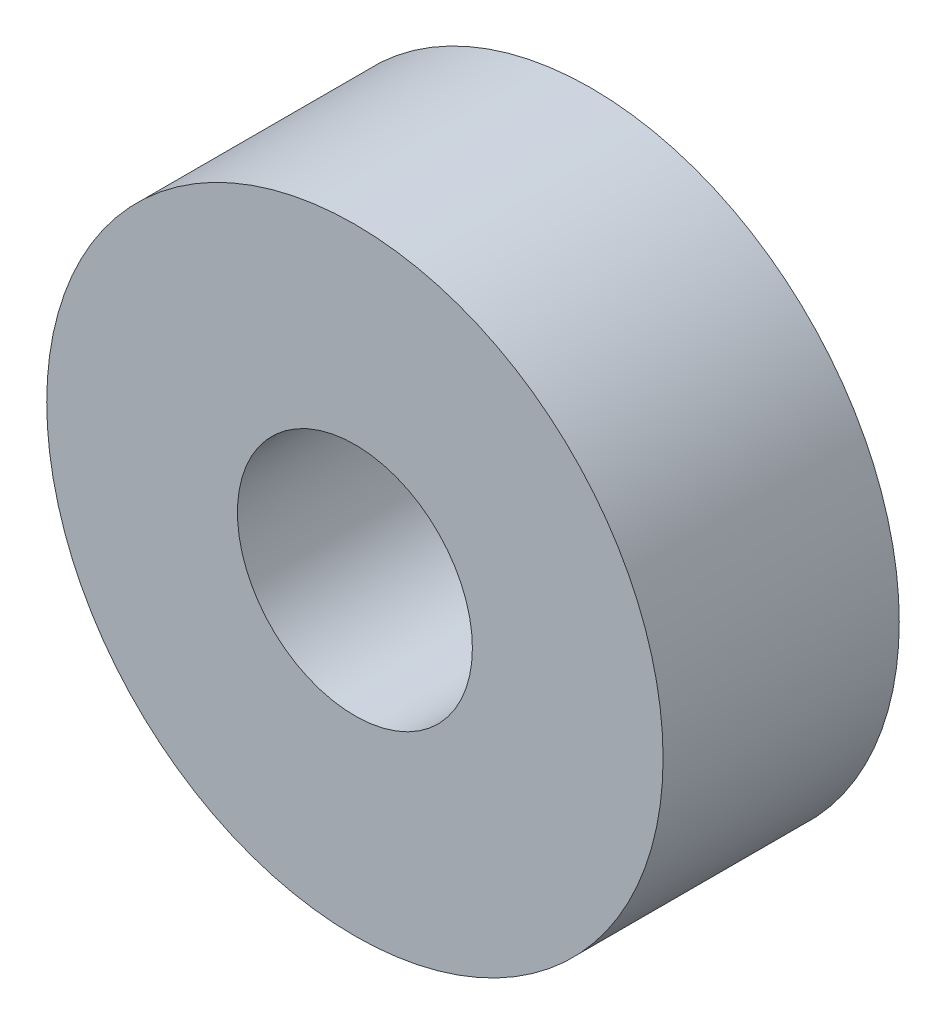
ISO-10303-21;
HEADER;
FILE_DESCRIPTION(('STEP AP214'),'2;1');
FILE_NAME('part.step','',(''),(''),'','','');
FILE_SCHEMA(('AUTOMOTIVE_DESIGN { 1 0 10303 214 1 1 1 1 }'));
ENDSEC;
DATA;
#1=APPLICATION_CONTEXT('core data for automotive mechanical design processes');
#2=APPLICATION_PROTOCOL_DEFINITION('international standard','automotive_design',2000,#1);
#3=PRODUCT_CONTEXT('',#1,'mechanical');
#4=PRODUCT('Part','Part','',(#3));
#5=PRODUCT_RELATED_PRODUCT_CATEGORY('part','',(#4));
#6=PRODUCT_DEFINITION_FORMATION('','',#4);
#7=PRODUCT_DEFINITION_CONTEXT('part definition',#1,'design');
#8=PRODUCT_DEFINITION('design','',#6,#7);
#9=PRODUCT_DEFINITION_SHAPE('','',#8);
#10=(LENGTH_UNIT() NAMED_UNIT(*) SI_UNIT(.MILLI.,.METRE.));
#11=(NAMED_UNIT(*) PLANE_ANGLE_UNIT() SI_UNIT($,.RADIAN.));
#12=(NAMED_UNIT(*) SI_UNIT($,.STERADIAN.) SOLID_ANGLE_UNIT());
#13=UNCERTAINTY_MEASURE_WITH_UNIT(LENGTH_MEASURE(1.E-05),#10,'distance_accuracy_value','');
#14=(GEOMETRIC_REPRESENTATION_CONTEXT(3) GLOBAL_UNCERTAINTY_ASSIGNED_CONTEXT((#13)) GLOBAL_UNIT_ASSIGNED_CONTEXT((#10,
#11,#12)) REPRESENTATION_CONTEXT('',''));
#15=CARTESIAN_POINT('',(0.,0.,0.));
#16=DIRECTION('',(0.,0.,1.));
#17=DIRECTION('',(1.,0.,0.));
#18=AXIS2_PLACEMENT_3D('',#15,#16,#17);
#19=CARTESIAN_POINT('',(0.,0.,9.9568));
#20=DIRECTION('',(0.,0.,1.));
#21=DIRECTION('',(1.,0.,0.));
#22=AXIS2_PLACEMENT_3D('',#19,#20,#21);
#23=PLANE('',#22);
#24=CARTESIAN_POINT('',(0.,0.,9.9568));
#25=DIRECTION('',(0.,0.,1.));
#26=DIRECTION('',(1.,0.,0.));
#27=AXIS2_PLACEMENT_3D('',#24,#25,#26);
#28=CIRCLE('',#27,12.9921);
#29=CARTESIAN_POINT('',(12.9921,0.,9.9568));
#30=VERTEX_POINT('',#29);
#31=EDGE_CURVE('E10',#30,#30,#28,.T.);
#32=ORIENTED_EDGE('',*,*,#31,.T.);
#33=EDGE_LOOP('',(#32));
#34=FACE_BOUND('',#33,.T.);
#35=CARTESIAN_POINT('',(0.,0.,9.9568));
#36=DIRECTION('',(0.,0.,1.));
#37=DIRECTION('',(1.,0.,0.));
#38=AXIS2_PLACEMENT_3D('',#35,#36,#37);
#39=CIRCLE('',#38,4.953);
#40=CARTESIAN_POINT('',(4.953,0.,9.9568));
#41=VERTEX_POINT('',#40);
#42=EDGE_CURVE('E41',#41,#41,#39,.T.);
#43=ORIENTED_EDGE('',*,*,#42,.F.);
#44=EDGE_LOOP('',(#43));
#45=FACE_BOUND('',#44,.T.);
#46=ADVANCED_FACE('F30',(#34,#45),#23,.T.);
#47=CARTESIAN_POINT('',(0.,0.,0.));
#48=DIRECTION('',(0.,0.,1.));
#49=DIRECTION('',(1.,0.,0.));
#50=AXIS2_PLACEMENT_3D('',#47,#48,#49);
#51=PLANE('',#50);
#52=CARTESIAN_POINT('',(0.,0.,0.));
#53=DIRECTION('',(0.,0.,1.));
#54=DIRECTION('',(1.,0.,0.));
#55=AXIS2_PLACEMENT_3D('',#52,#53,#54);
#56=CIRCLE('',#55,12.9921);
#57=CARTESIAN_POINT('',(12.9921,0.,0.));
#58=VERTEX_POINT('',#57);
#59=EDGE_CURVE('E34',#58,#58,#56,.T.);
#60=ORIENTED_EDGE('',*,*,#59,.F.);
#61=EDGE_LOOP('',(#60));
#62=FACE_BOUND('',#61,.T.);
#63=CARTESIAN_POINT('',(0.,0.,0.));
#64=DIRECTION('',(0.,0.,1.));
#65=DIRECTION('',(1.,0.,0.));
#66=AXIS2_PLACEMENT_3D('',#63,#64,#65);
#67=CIRCLE('',#66,4.953);
#68=CARTESIAN_POINT('',(4.953,0.,0.));
#69=VERTEX_POINT('',#68);
#70=EDGE_CURVE('E43',#69,#69,#67,.T.);
#71=ORIENTED_EDGE('',*,*,#70,.T.);
#72=EDGE_LOOP('',(#71));
#73=FACE_BOUND('',#72,.T.);
#74=ADVANCED_FACE('F53',(#62,#73),#51,.F.);
#75=CARTESIAN_POINT('',(0.,0.,9.9568));
#76=DIRECTION('',(0.,0.,-1.));
#77=DIRECTION('',(-1.,0.,0.));
#78=AXIS2_PLACEMENT_3D('',#75,#76,#77);
#79=CYLINDRICAL_SURFACE('',#78,12.9921);
#80=ORIENTED_EDGE('',*,*,#31,.F.);
#81=EDGE_LOOP('',(#80));
#82=FACE_BOUND('',#81,.T.);
#83=ORIENTED_EDGE('',*,*,#59,.T.);
#84=EDGE_LOOP('',(#83));
#85=FACE_BOUND('',#84,.T.);
#86=ADVANCED_FACE('F32',(#82,#85),#79,.T.);
#87=CARTESIAN_POINT('',(0.,0.,9.9568));
#88=DIRECTION('',(0.,0.,-1.));
#89=DIRECTION('',(-1.,0.,0.));
#90=AXIS2_PLACEMENT_3D('',#87,#88,#89);
#91=CYLINDRICAL_SURFACE('',#90,4.953);
#92=ORIENTED_EDGE('',*,*,#42,.T.);
#93=EDGE_LOOP('',(#92));
#94=FACE_BOUND('',#93,.T.);
#95=ORIENTED_EDGE('',*,*,#70,.F.);
#96=EDGE_LOOP('',(#95));
#97=FACE_BOUND('',#96,.T.);
#98=ADVANCED_FACE('F49',(#94,#97),#91,.F.);
#99=CLOSED_SHELL('',(#46,#74,#86,#98));
#100=MANIFOLD_SOLID_BREP('B2',#99);
#101=ADVANCED_BREP_SHAPE_REPRESENTATION('',(#18,#100),#14);
#102=SHAPE_DEFINITION_REPRESENTATION(#9,#101);
ENDSEC;
END-ISO-10303-21;
